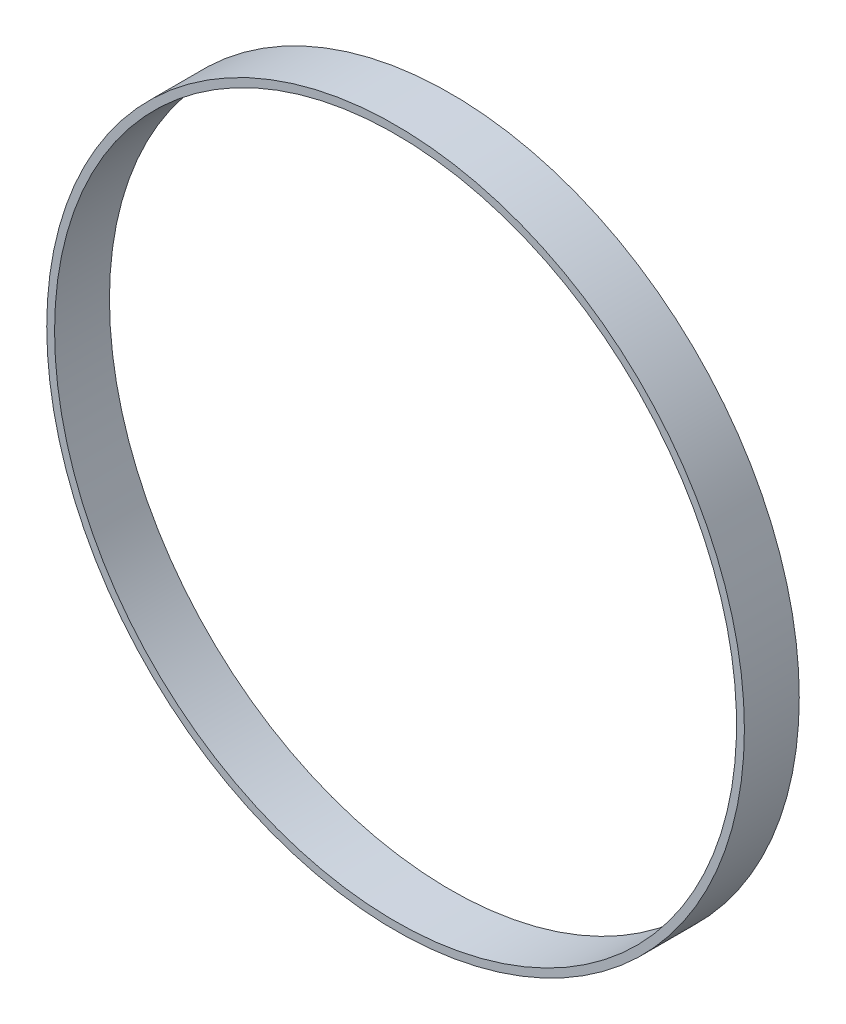
ISO-10303-21;
HEADER;
FILE_DESCRIPTION(('STEP AP214'),'2;1');
FILE_NAME('part.step','',(''),(''),'','','');
FILE_SCHEMA(('AUTOMOTIVE_DESIGN { 1 0 10303 214 1 1 1 1 }'));
ENDSEC;
DATA;
#1=APPLICATION_CONTEXT('core data for automotive mechanical design processes');
#2=APPLICATION_PROTOCOL_DEFINITION('international standard','automotive_design',2000,#1);
#3=PRODUCT_CONTEXT('',#1,'mechanical');
#4=PRODUCT('Part','Part','',(#3));
#5=PRODUCT_RELATED_PRODUCT_CATEGORY('part','',(#4));
#6=PRODUCT_DEFINITION_FORMATION('','',#4);
#7=PRODUCT_DEFINITION_CONTEXT('part definition',#1,'design');
#8=PRODUCT_DEFINITION('design','',#6,#7);
#9=PRODUCT_DEFINITION_SHAPE('','',#8);
#10=(LENGTH_UNIT() NAMED_UNIT(*) SI_UNIT(.MILLI.,.METRE.));
#11=(NAMED_UNIT(*) PLANE_ANGLE_UNIT() SI_UNIT($,.RADIAN.));
#12=(NAMED_UNIT(*) SI_UNIT($,.STERADIAN.) SOLID_ANGLE_UNIT());
#13=UNCERTAINTY_MEASURE_WITH_UNIT(LENGTH_MEASURE(1.E-05),#10,'distance_accuracy_value','');
#14=(GEOMETRIC_REPRESENTATION_CONTEXT(3) GLOBAL_UNCERTAINTY_ASSIGNED_CONTEXT((#13)) GLOBAL_UNIT_ASSIGNED_CONTEXT((#10,
#11,#12)) REPRESENTATION_CONTEXT('',''));
#15=CARTESIAN_POINT('',(0.,0.,0.));
#16=DIRECTION('',(0.,0.,1.));
#17=DIRECTION('',(1.,0.,0.));
#18=AXIS2_PLACEMENT_3D('',#15,#16,#17);
#19=CARTESIAN_POINT('',(0.,0.,63.));
#20=DIRECTION('',(0.,0.,1.));
#21=DIRECTION('',(1.,0.,0.));
#22=AXIS2_PLACEMENT_3D('',#19,#20,#21);
#23=PLANE('',#22);
#24=CARTESIAN_POINT('',(0.,0.,63.));
#25=DIRECTION('',(0.,0.,-1.));
#26=DIRECTION('',(1.,0.,0.));
#27=AXIS2_PLACEMENT_3D('',#24,#25,#26);
#28=CIRCLE('',#27,44.5);
#29=CARTESIAN_POINT('',(-44.5,0.,63.));
#30=VERTEX_POINT('',#29);
#31=EDGE_CURVE('E11',#30,#30,#28,.T.);
#32=ORIENTED_EDGE('',*,*,#31,.T.);
#33=EDGE_LOOP('',(#32));
#34=FACE_BOUND('',#33,.T.);
#35=CARTESIAN_POINT('',(0.,0.,63.));
#36=DIRECTION('',(0.,0.,1.));
#37=DIRECTION('',(1.,0.,0.));
#38=AXIS2_PLACEMENT_3D('',#35,#36,#37);
#39=CIRCLE('',#38,43.5);
#40=CARTESIAN_POINT('',(-43.5,0.,63.));
#41=VERTEX_POINT('',#40);
#42=EDGE_CURVE('E27',#41,#41,#39,.T.);
#43=ORIENTED_EDGE('',*,*,#42,.T.);
#44=EDGE_LOOP('',(#43));
#45=FACE_BOUND('',#44,.T.);
#46=ADVANCED_FACE('F16',(#34,#45),#23,.F.);
#47=CARTESIAN_POINT('',(0.,0.,66.5));
#48=DIRECTION('',(0.,0.,1.));
#49=DIRECTION('',(1.,0.,0.));
#50=AXIS2_PLACEMENT_3D('',#47,#48,#49);
#51=CYLINDRICAL_SURFACE('',#50,43.5);
#52=CARTESIAN_POINT('',(0.,0.,70.));
#53=DIRECTION('',(0.,0.,-1.));
#54=DIRECTION('',(1.,0.,0.));
#55=AXIS2_PLACEMENT_3D('',#52,#53,#54);
#56=CIRCLE('',#55,43.5);
#57=CARTESIAN_POINT('',(-43.5,0.,70.));
#58=VERTEX_POINT('',#57);
#59=EDGE_CURVE('E52',#58,#58,#56,.T.);
#60=ORIENTED_EDGE('',*,*,#59,.F.);
#61=DIRECTION('',(0.,0.,-1.));
#62=VECTOR('',#61,1.);
#63=CARTESIAN_POINT('',(-43.5,0.,66.5));
#64=LINE('',#63,#62);
#65=EDGE_CURVE('E54',#58,#41,#64,.T.);
#66=ORIENTED_EDGE('',*,*,#65,.T.);
#67=ORIENTED_EDGE('',*,*,#42,.F.);
#68=ORIENTED_EDGE('',*,*,#65,.F.);
#69=EDGE_LOOP('',(#60,#66,#67,#68));
#70=FACE_BOUND('',#69,.T.);
#71=ADVANCED_FACE('F53',(#70),#51,.F.);
#72=CARTESIAN_POINT('',(0.,0.,66.5));
#73=DIRECTION('',(0.,0.,1.));
#74=DIRECTION('',(1.,0.,0.));
#75=AXIS2_PLACEMENT_3D('',#72,#73,#74);
#76=CYLINDRICAL_SURFACE('',#75,44.5);
#77=CARTESIAN_POINT('',(0.,0.,70.));
#78=DIRECTION('',(0.,0.,1.));
#79=DIRECTION('',(1.,0.,0.));
#80=AXIS2_PLACEMENT_3D('',#77,#78,#79);
#81=CIRCLE('',#80,44.5);
#82=CARTESIAN_POINT('',(-44.5,0.,70.));
#83=VERTEX_POINT('',#82);
#84=EDGE_CURVE('E20',#83,#83,#81,.T.);
#85=ORIENTED_EDGE('',*,*,#84,.F.);
#86=DIRECTION('',(0.,0.,-1.));
#87=VECTOR('',#86,1.);
#88=CARTESIAN_POINT('',(-44.5,0.,66.5));
#89=LINE('',#88,#87);
#90=EDGE_CURVE('E61',#83,#30,#89,.T.);
#91=ORIENTED_EDGE('',*,*,#90,.T.);
#92=ORIENTED_EDGE('',*,*,#31,.F.);
#93=ORIENTED_EDGE('',*,*,#90,.F.);
#94=EDGE_LOOP('',(#85,#91,#92,#93));
#95=FACE_BOUND('',#94,.T.);
#96=ADVANCED_FACE('F69',(#95),#76,.T.);
#97=CARTESIAN_POINT('',(0.,0.,70.));
#98=DIRECTION('',(0.,0.,1.));
#99=DIRECTION('',(1.,0.,0.));
#100=AXIS2_PLACEMENT_3D('',#97,#98,#99);
#101=PLANE('',#100);
#102=ORIENTED_EDGE('',*,*,#84,.T.);
#103=EDGE_LOOP('',(#102));
#104=FACE_BOUND('',#103,.T.);
#105=ORIENTED_EDGE('',*,*,#59,.T.);
#106=EDGE_LOOP('',(#105));
#107=FACE_BOUND('',#106,.T.);
#108=ADVANCED_FACE('F18',(#104,#107),#101,.T.);
#109=CLOSED_SHELL('',(#46,#71,#96,#108));
#110=MANIFOLD_SOLID_BREP('B1',#109);
#111=ADVANCED_BREP_SHAPE_REPRESENTATION('',(#18,#110),#14);
#112=SHAPE_DEFINITION_REPRESENTATION(#9,#111);
ENDSEC;
END-ISO-10303-21;
